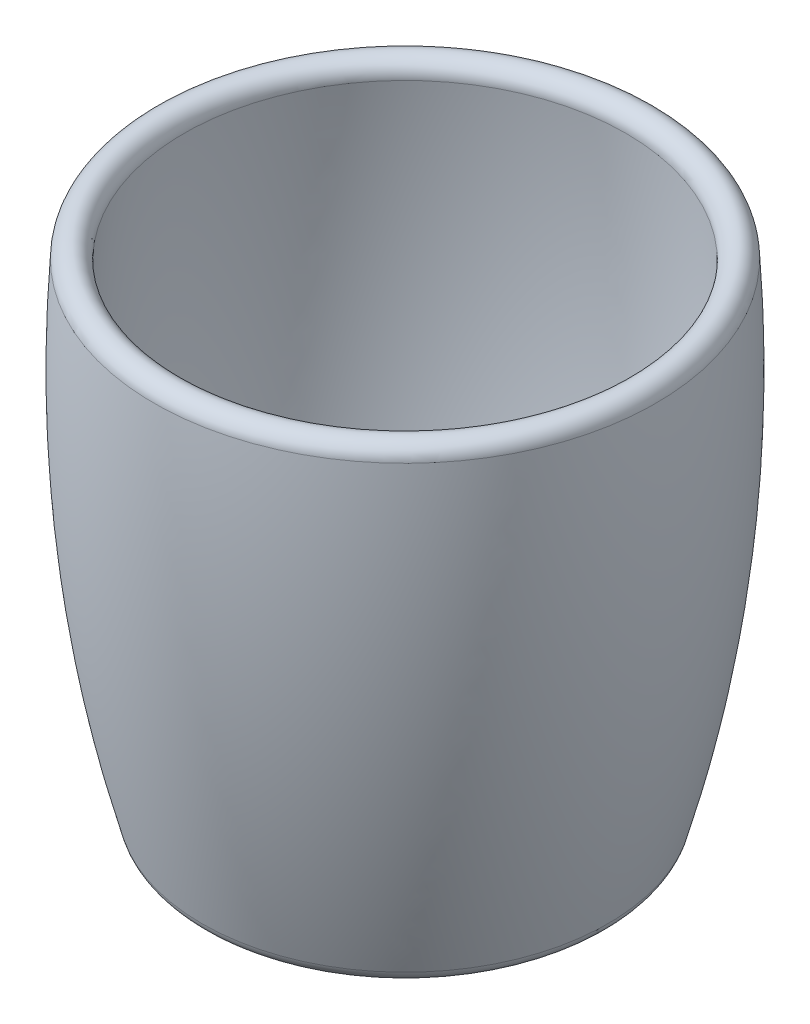
ISO-10303-21;
HEADER;
FILE_DESCRIPTION(('STEP AP214'),'2;1');
FILE_NAME('part.step','',(''),(''),'','','');
FILE_SCHEMA(('AUTOMOTIVE_DESIGN { 1 0 10303 214 1 1 1 1 }'));
ENDSEC;
DATA;
#1=APPLICATION_CONTEXT('core data for automotive mechanical design processes');
#2=APPLICATION_PROTOCOL_DEFINITION('international standard','automotive_design',2000,#1);
#3=PRODUCT_CONTEXT('',#1,'mechanical');
#4=PRODUCT('Part','Part','',(#3));
#5=PRODUCT_RELATED_PRODUCT_CATEGORY('part','',(#4));
#6=PRODUCT_DEFINITION_FORMATION('','',#4);
#7=PRODUCT_DEFINITION_CONTEXT('part definition',#1,'design');
#8=PRODUCT_DEFINITION('design','',#6,#7);
#9=PRODUCT_DEFINITION_SHAPE('','',#8);
#10=(LENGTH_UNIT() NAMED_UNIT(*) SI_UNIT(.MILLI.,.METRE.));
#11=(NAMED_UNIT(*) PLANE_ANGLE_UNIT() SI_UNIT($,.RADIAN.));
#12=(NAMED_UNIT(*) SI_UNIT($,.STERADIAN.) SOLID_ANGLE_UNIT());
#13=UNCERTAINTY_MEASURE_WITH_UNIT(LENGTH_MEASURE(1.E-05),#10,'distance_accuracy_value','');
#14=(GEOMETRIC_REPRESENTATION_CONTEXT(3) GLOBAL_UNCERTAINTY_ASSIGNED_CONTEXT((#13)) GLOBAL_UNIT_ASSIGNED_CONTEXT((#10,
#11,#12)) REPRESENTATION_CONTEXT('',''));
#15=CARTESIAN_POINT('',(0.,0.,0.));
#16=DIRECTION('',(0.,0.,1.));
#17=DIRECTION('',(1.,0.,0.));
#18=AXIS2_PLACEMENT_3D('',#15,#16,#17);
#19=CARTESIAN_POINT('',(0.,5.,0.));
#20=DIRECTION('',(0.,1.,0.));
#21=DIRECTION('',(0.,0.,1.));
#22=AXIS2_PLACEMENT_3D('',#19,#20,#21);
#23=PLANE('',#22);
#24=CARTESIAN_POINT('',(0.,5.,0.));
#25=DIRECTION('',(0.,1.,0.));
#26=DIRECTION('',(0.,0.,1.));
#27=AXIS2_PLACEMENT_3D('',#24,#25,#26);
#28=CIRCLE('',#27,27.1394631480316);
#29=CARTESIAN_POINT('',(0.,5.,27.1394631480316));
#30=VERTEX_POINT('',#29);
#31=EDGE_CURVE('E10',#30,#30,#28,.T.);
#32=ORIENTED_EDGE('',*,*,#31,.T.);
#33=EDGE_LOOP('',(#32));
#34=FACE_BOUND('',#33,.T.);
#35=ADVANCED_FACE('F40',(#34),#23,.T.);
#36=CARTESIAN_POINT('',(36.8600854260039,81.0825845872973,0.));
#37=CARTESIAN_POINT('',(39.3568647819483,41.7804731651459,0.));
#38=CARTESIAN_POINT('',(29.4503987170399,5.,0.));
#39=B_SPLINE_CURVE_WITH_KNOTS('',2,(#36,#37,#38),.UNSPECIFIED.,.F.,.F.,(3,3),
(0.0469697665605404,1.),.UNSPECIFIED.);
#40=CARTESIAN_POINT('',(0.,0.,0.));
#41=DIRECTION('',(0.,-1.,0.));
#42=AXIS1_PLACEMENT('',#40,#41);
#43=SURFACE_OF_REVOLUTION('',#39,#42);
#44=CARTESIAN_POINT('',(0.,7.24918293076535,0.));
#45=DIRECTION('',(0.,-1.,0.));
#46=DIRECTION('',(0.,0.,-1.));
#47=AXIS2_PLACEMENT_3D('',#44,#45,#46);
#48=CIRCLE('',#47,30.0439895687319);
#49=CARTESIAN_POINT('',(0.,7.24918293076535,-30.0439895687319));
#50=VERTEX_POINT('',#49);
#51=EDGE_CURVE('E42',#50,#50,#48,.T.);
#52=ORIENTED_EDGE('',*,*,#51,.T.);
#53=EDGE_LOOP('',(#52));
#54=FACE_BOUND('',#53,.T.);
#55=CARTESIAN_POINT('',(0.,81.0825845872973,0.));
#56=DIRECTION('',(0.,-1.,0.));
#57=DIRECTION('',(0.,0.,-1.));
#58=AXIS2_PLACEMENT_3D('',#55,#56,#57);
#59=CIRCLE('',#58,36.8600854260039);
#60=CARTESIAN_POINT('',(0.,81.0825845872973,-36.8600854260039));
#61=VERTEX_POINT('',#60);
#62=EDGE_CURVE('E60',#61,#61,#59,.T.);
#63=ORIENTED_EDGE('',*,*,#62,.F.);
#64=EDGE_LOOP('',(#63));
#65=FACE_BOUND('',#64,.T.);
#66=ADVANCED_FACE('F74',(#54,#65),#43,.F.);
#67=CARTESIAN_POINT('',(0.,81.2412922936487,0.));
#68=DIRECTION('',(0.,-1.,0.));
#69=DIRECTION('',(0.,0.,-1.));
#70=AXIS2_PLACEMENT_3D('',#67,#68,#69);
#71=TOROIDAL_SURFACE('',#70,39.3550427130019,2.5);
#72=ORIENTED_EDGE('',*,*,#62,.T.);
#73=EDGE_LOOP('',(#72));
#74=FACE_BOUND('',#73,.T.);
#75=CARTESIAN_POINT('',(0.,81.4,0.));
#76=DIRECTION('',(0.,-1.,0.));
#77=DIRECTION('',(0.,0.,-1.));
#78=AXIS2_PLACEMENT_3D('',#75,#76,#77);
#79=CIRCLE('',#78,41.85);
#80=CARTESIAN_POINT('',(0.,81.4,-41.85));
#81=VERTEX_POINT('',#80);
#82=EDGE_CURVE('E58',#81,#81,#79,.T.);
#83=ORIENTED_EDGE('',*,*,#82,.F.);
#84=EDGE_LOOP('',(#83));
#85=FACE_BOUND('',#84,.T.);
#86=ADVANCED_FACE('F76',(#74,#85),#71,.T.);
#87=CARTESIAN_POINT('',(33.25,0.,0.));
#88=CARTESIAN_POINT('',(44.5264153668564,39.325533825124,0.));
#89=CARTESIAN_POINT('',(41.85,81.4,0.));
#90=B_SPLINE_CURVE_WITH_KNOTS('',2,(#87,#88,#89),.UNSPECIFIED.,.F.,.F.,(3,3),(0.,1.),.UNSPECIFIED.);
#91=CARTESIAN_POINT('',(0.,0.,0.));
#92=DIRECTION('',(0.,-1.,0.));
#93=AXIS1_PLACEMENT('',#91,#92);
#94=SURFACE_OF_REVOLUTION('',#90,#93);
#95=CARTESIAN_POINT('',(0.,2.2010743018274,0.));
#96=DIRECTION('',(0.,-1.,0.));
#97=DIRECTION('',(0.,0.,-1.));
#98=AXIS2_PLACEMENT_3D('',#95,#96,#97);
#99=CIRCLE('',#98,33.86962555237);
#100=CARTESIAN_POINT('',(0.,2.2010743018274,-33.86962555237));
#101=VERTEX_POINT('',#100);
#102=EDGE_CURVE('E48',#101,#101,#99,.F.);
#103=ORIENTED_EDGE('',*,*,#102,.T.);
#104=EDGE_LOOP('',(#103));
#105=FACE_BOUND('',#104,.T.);
#106=ORIENTED_EDGE('',*,*,#82,.T.);
#107=EDGE_LOOP('',(#106));
#108=FACE_BOUND('',#107,.T.);
#109=ADVANCED_FACE('F89',(#105,#108),#94,.F.);
#110=CARTESIAN_POINT('',(0.,0.,0.));
#111=DIRECTION('',(0.,-1.,0.));
#112=DIRECTION('',(0.,0.,-1.));
#113=AXIS2_PLACEMENT_3D('',#110,#111,#112);
#114=PLANE('',#113);
#115=CARTESIAN_POINT('',(0.,0.,0.));
#116=DIRECTION('',(0.,-1.,0.));
#117=DIRECTION('',(0.,0.,-1.));
#118=AXIS2_PLACEMENT_3D('',#115,#116,#117);
#119=CIRCLE('',#118,30.9779620642027);
#120=CARTESIAN_POINT('',(0.,0.,-30.9779620642027));
#121=VERTEX_POINT('',#120);
#122=EDGE_CURVE('E55',#121,#121,#119,.T.);
#123=ORIENTED_EDGE('',*,*,#122,.T.);
#124=EDGE_LOOP('',(#123));
#125=FACE_BOUND('',#124,.T.);
#126=ADVANCED_FACE('F81',(#125),#114,.T.);
#127=CARTESIAN_POINT('',(0.,3.,0.));
#128=DIRECTION('',(0.,-1.,0.));
#129=DIRECTION('',(0.,0.,-1.));
#130=AXIS2_PLACEMENT_3D('',#127,#128,#129);
#131=TOROIDAL_SURFACE('',#130,30.9779620642027,3.);
#132=ORIENTED_EDGE('',*,*,#102,.F.);
#133=EDGE_LOOP('',(#132));
#134=FACE_BOUND('',#133,.T.);
#135=ORIENTED_EDGE('',*,*,#122,.F.);
#136=EDGE_LOOP('',(#135));
#137=FACE_BOUND('',#136,.T.);
#138=ADVANCED_FACE('F83',(#134,#137),#131,.T.);
#139=CARTESIAN_POINT('',(0.,8.,0.));
#140=DIRECTION('',(0.,-1.,0.));
#141=DIRECTION('',(0.,0.,-1.));
#142=AXIS2_PLACEMENT_3D('',#139,#140,#141);
#143=TOROIDAL_SURFACE('',#142,27.1394631480316,3.);
#144=ORIENTED_EDGE('',*,*,#31,.F.);
#145=EDGE_LOOP('',(#144));
#146=FACE_BOUND('',#145,.T.);
#147=ORIENTED_EDGE('',*,*,#51,.F.);
#148=EDGE_LOOP('',(#147));
#149=FACE_BOUND('',#148,.T.);
#150=ADVANCED_FACE('F39',(#146,#149),#143,.F.);
#151=CLOSED_SHELL('',(#35,#66,#86,#109,#126,#138,#150));
#152=MANIFOLD_SOLID_BREP('B2',#151);
#153=ADVANCED_BREP_SHAPE_REPRESENTATION('',(#18,#152),#14);
#154=SHAPE_DEFINITION_REPRESENTATION(#9,#153);
ENDSEC;
END-ISO-10303-21;
